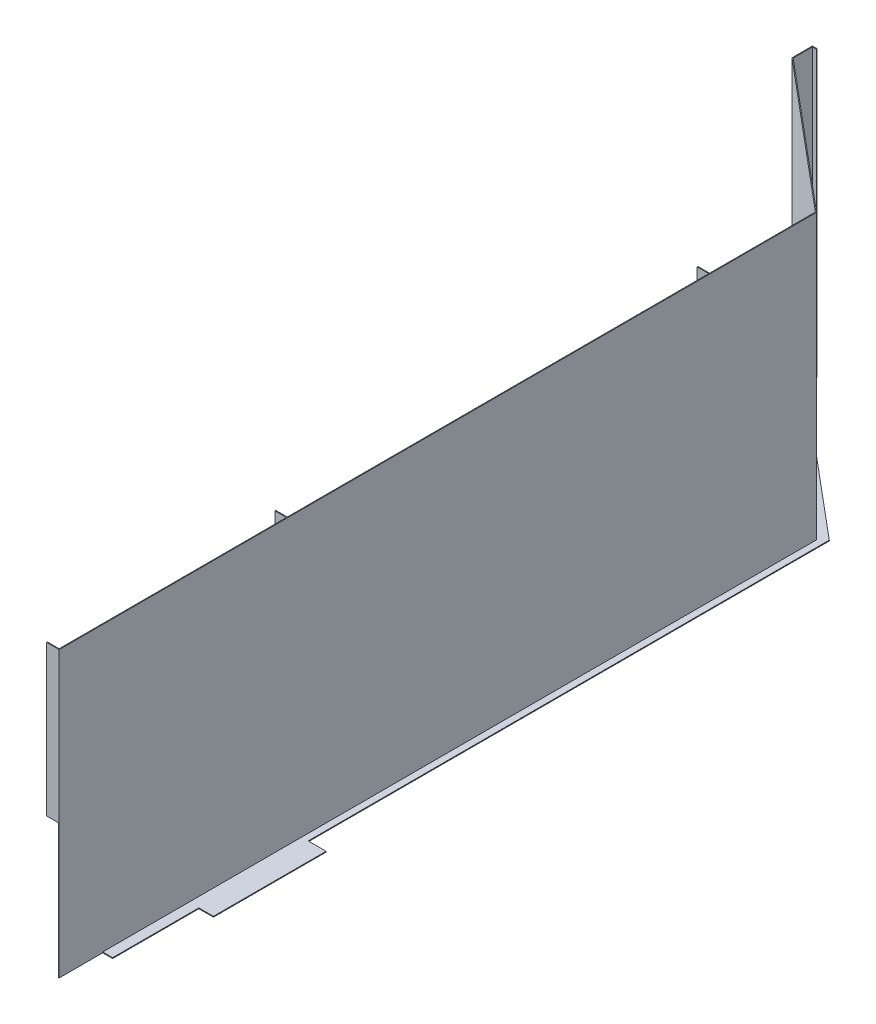
ISO-10303-21;
HEADER;
FILE_DESCRIPTION(('STEP AP214'),'2;1');
FILE_NAME('part.step','',(''),(''),'','','');
FILE_SCHEMA(('AUTOMOTIVE_DESIGN { 1 0 10303 214 1 1 1 1 }'));
ENDSEC;
DATA;
#1=APPLICATION_CONTEXT('core data for automotive mechanical design processes');
#2=APPLICATION_PROTOCOL_DEFINITION('international standard','automotive_design',2000,#1);
#3=PRODUCT_CONTEXT('',#1,'mechanical');
#4=PRODUCT('Part','Part','',(#3));
#5=PRODUCT_RELATED_PRODUCT_CATEGORY('part','',(#4));
#6=PRODUCT_DEFINITION_FORMATION('','',#4);
#7=PRODUCT_DEFINITION_CONTEXT('part definition',#1,'design');
#8=PRODUCT_DEFINITION('design','',#6,#7);
#9=PRODUCT_DEFINITION_SHAPE('','',#8);
#10=(LENGTH_UNIT() NAMED_UNIT(*) SI_UNIT(.MILLI.,.METRE.));
#11=(NAMED_UNIT(*) PLANE_ANGLE_UNIT() SI_UNIT($,.RADIAN.));
#12=(NAMED_UNIT(*) SI_UNIT($,.STERADIAN.) SOLID_ANGLE_UNIT());
#13=UNCERTAINTY_MEASURE_WITH_UNIT(LENGTH_MEASURE(1.E-05),#10,'distance_accuracy_value','');
#14=(GEOMETRIC_REPRESENTATION_CONTEXT(3) GLOBAL_UNCERTAINTY_ASSIGNED_CONTEXT((#13)) GLOBAL_UNIT_ASSIGNED_CONTEXT((#10,
#11,#12)) REPRESENTATION_CONTEXT('',''));
#15=CARTESIAN_POINT('',(0.,0.,0.));
#16=DIRECTION('',(0.,0.,1.));
#17=DIRECTION('',(1.,0.,0.));
#18=AXIS2_PLACEMENT_3D('',#15,#16,#17);
#19=CARTESIAN_POINT('',(1030.,1386.,1771.15));
#20=DIRECTION('',(0.,1.,0.));
#21=DIRECTION('',(0.,0.,-1.));
#22=AXIS2_PLACEMENT_3D('',#19,#20,#21);
#23=PLANE('',#22);
#24=DIRECTION('',(0.,0.,1.));
#25=VECTOR('',#24,1.);
#26=CARTESIAN_POINT('',(1000.,1386.,1769.15));
#27=LINE('',#26,#25);
#28=CARTESIAN_POINT('',(1000.,1386.,1769.15));
#29=VERTEX_POINT('',#28);
#30=CARTESIAN_POINT('',(1000.,1386.,1771.15));
#31=VERTEX_POINT('',#30);
#32=EDGE_CURVE('E42',#29,#31,#27,.T.);
#33=ORIENTED_EDGE('',*,*,#32,.F.);
#34=DIRECTION('',(-1.,0.,0.));
#35=VECTOR('',#34,1.);
#36=CARTESIAN_POINT('',(1030.,1386.,1769.15));
#37=LINE('',#36,#35);
#38=CARTESIAN_POINT('',(1030.,1386.,1769.15));
#39=VERTEX_POINT('',#38);
#40=EDGE_CURVE('E453',#39,#29,#37,.T.);
#41=ORIENTED_EDGE('',*,*,#40,.F.);
#42=DIRECTION('',(0.,0.,-1.));
#43=VECTOR('',#42,1.);
#44=CARTESIAN_POINT('',(1030.,1386.,1771.15));
#45=LINE('',#44,#43);
#46=CARTESIAN_POINT('',(1030.,1386.,1771.15));
#47=VERTEX_POINT('',#46);
#48=EDGE_CURVE('E487',#47,#39,#45,.T.);
#49=ORIENTED_EDGE('',*,*,#48,.F.);
#50=DIRECTION('',(1.,0.,0.));
#51=VECTOR('',#50,1.);
#52=CARTESIAN_POINT('',(1000.,1386.,1771.15));
#53=LINE('',#52,#51);
#54=EDGE_CURVE('E11',#31,#47,#53,.T.);
#55=ORIENTED_EDGE('',*,*,#54,.F.);
#56=EDGE_LOOP('',(#33,#41,#49,#55));
#57=FACE_BOUND('',#56,.T.);
#58=ADVANCED_FACE('F17',(#57),#23,.F.);
#59=CARTESIAN_POINT('',(1000.,1041.,1771.15));
#60=DIRECTION('',(0.,0.,1.));
#61=DIRECTION('',(1.,0.,0.));
#62=AXIS2_PLACEMENT_3D('',#59,#60,#61);
#63=PLANE('',#62);
#64=DIRECTION('',(0.,1.,0.));
#65=VECTOR('',#64,1.);
#66=CARTESIAN_POINT('',(1000.,1386.,1771.15));
#67=LINE('',#66,#65);
#68=CARTESIAN_POINT('',(1000.,1773.,1771.15));
#69=VERTEX_POINT('',#68);
#70=EDGE_CURVE('E558',#31,#69,#67,.T.);
#71=ORIENTED_EDGE('',*,*,#70,.F.);
#72=ORIENTED_EDGE('',*,*,#54,.T.);
#73=DIRECTION('',(0.,1.,0.));
#74=VECTOR('',#73,1.);
#75=CARTESIAN_POINT('',(1030.,1041.,1771.15));
#76=LINE('',#75,#74);
#77=CARTESIAN_POINT('',(1030.,1041.,1771.15));
#78=VERTEX_POINT('',#77);
#79=EDGE_CURVE('E350',#78,#47,#76,.T.);
#80=ORIENTED_EDGE('',*,*,#79,.F.);
#81=DIRECTION('',(1.,0.,0.));
#82=VECTOR('',#81,1.);
#83=CARTESIAN_POINT('',(1030.,1041.,1771.15));
#84=LINE('',#83,#82);
#85=CARTESIAN_POINT('',(1032.,1041.,1771.15));
#86=VERTEX_POINT('',#85);
#87=EDGE_CURVE('E28',#78,#86,#84,.T.);
#88=ORIENTED_EDGE('',*,*,#87,.T.);
#89=DIRECTION('',(0.,1.,0.));
#90=VECTOR('',#89,1.);
#91=CARTESIAN_POINT('',(1032.,1041.,1771.15));
#92=LINE('',#91,#90);
#93=CARTESIAN_POINT('',(1032.,1773.,1771.15));
#94=VERTEX_POINT('',#93);
#95=EDGE_CURVE('E332',#86,#94,#92,.T.);
#96=ORIENTED_EDGE('',*,*,#95,.T.);
#97=DIRECTION('',(1.,0.,0.));
#98=VECTOR('',#97,1.);
#99=CARTESIAN_POINT('',(1000.,1773.,1771.15));
#100=LINE('',#99,#98);
#101=EDGE_CURVE('E366',#69,#94,#100,.T.);
#102=ORIENTED_EDGE('',*,*,#101,.F.);
#103=EDGE_LOOP('',(#71,#72,#80,#88,#96,#102));
#104=FACE_BOUND('',#103,.T.);
#105=ADVANCED_FACE('F348',(#104),#63,.T.);
#106=CARTESIAN_POINT('',(1095.,1773.,1821.15));
#107=DIRECTION('',(0.,-1.,0.));
#108=DIRECTION('',(1.,0.,0.));
#109=AXIS2_PLACEMENT_3D('',#106,#107,#108);
#110=PLANE('',#109);
#111=DIRECTION('',(-0.766044443119007,0.,-0.642787609686505));
#112=VECTOR('',#111,1.);
#113=CARTESIAN_POINT('',(1032.,1773.,-178.026737939697));
#114=LINE('',#113,#112);
#115=CARTESIAN_POINT('',(1032.,1773.,-178.026737939697));
#116=VERTEX_POINT('',#115);
#117=CARTESIAN_POINT('',(658.,1773.,-491.85));
#118=VERTEX_POINT('',#117);
#119=EDGE_CURVE('E344',#116,#118,#114,.T.);
#120=ORIENTED_EDGE('',*,*,#119,.T.);
#121=DIRECTION('',(0.,0.,-1.));
#122=VECTOR('',#121,1.);
#123=CARTESIAN_POINT('',(658.,1773.,-491.85));
#124=LINE('',#123,#122);
#125=CARTESIAN_POINT('',(658.,1773.,-541.35));
#126=VERTEX_POINT('',#125);
#127=EDGE_CURVE('E395',#118,#126,#124,.T.);
#128=ORIENTED_EDGE('',*,*,#127,.T.);
#129=DIRECTION('',(1.,0.,0.));
#130=VECTOR('',#129,1.);
#131=CARTESIAN_POINT('',(658.,1773.,-541.35));
#132=LINE('',#131,#130);
#133=CARTESIAN_POINT('',(668.,1773.,-541.35));
#134=VERTEX_POINT('',#133);
#135=EDGE_CURVE('E590',#126,#134,#132,.T.);
#136=ORIENTED_EDGE('',*,*,#135,.T.);
#137=DIRECTION('',(0.,0.,-1.));
#138=VECTOR('',#137,1.);
#139=CARTESIAN_POINT('',(668.,1773.,-541.35));
#140=LINE('',#139,#138);
#141=CARTESIAN_POINT('',(668.,1773.,-543.35));
#142=VERTEX_POINT('',#141);
#143=EDGE_CURVE('E553',#134,#142,#140,.T.);
#144=ORIENTED_EDGE('',*,*,#143,.T.);
#145=DIRECTION('',(-1.,0.,0.));
#146=VECTOR('',#145,1.);
#147=CARTESIAN_POINT('',(668.,1773.,-543.35));
#148=LINE('',#147,#146);
#149=CARTESIAN_POINT('',(656.,1773.,-543.35));
#150=VERTEX_POINT('',#149);
#151=EDGE_CURVE('E549',#142,#150,#148,.T.);
#152=ORIENTED_EDGE('',*,*,#151,.T.);
#153=DIRECTION('',(0.,0.,1.));
#154=VECTOR('',#153,1.);
#155=CARTESIAN_POINT('',(656.,1773.,-543.35));
#156=LINE('',#155,#154);
#157=CARTESIAN_POINT('',(656.,1773.,-490.917384683687));
#158=VERTEX_POINT('',#157);
#159=EDGE_CURVE('E554',#150,#158,#156,.T.);
#160=ORIENTED_EDGE('',*,*,#159,.T.);
#161=DIRECTION('',(0.766044443119007,0.,0.642787609686505));
#162=VECTOR('',#161,1.);
#163=CARTESIAN_POINT('',(656.,1773.,-490.917384683687));
#164=LINE('',#163,#162);
#165=CARTESIAN_POINT('',(1030.,1773.,-177.094122623397));
#166=VERTEX_POINT('',#165);
#167=EDGE_CURVE('E691',#158,#166,#164,.T.);
#168=ORIENTED_EDGE('',*,*,#167,.T.);
#169=DIRECTION('',(0.,0.,1.));
#170=VECTOR('',#169,1.);
#171=CARTESIAN_POINT('',(1030.,1773.,-177.094122623397));
#172=LINE('',#171,#170);
#173=CARTESIAN_POINT('',(1030.,1773.,95.150000000003));
#174=VERTEX_POINT('',#173);
#175=EDGE_CURVE('E257',#166,#174,#172,.T.);
#176=ORIENTED_EDGE('',*,*,#175,.T.);
#177=DIRECTION('',(-1.,0.,0.));
#178=VECTOR('',#177,1.);
#179=CARTESIAN_POINT('',(1030.,1773.,95.150000000003));
#180=LINE('',#179,#178);
#181=CARTESIAN_POINT('',(1000.,1773.,95.150000000003));
#182=VERTEX_POINT('',#181);
#183=EDGE_CURVE('E264',#174,#182,#180,.T.);
#184=ORIENTED_EDGE('',*,*,#183,.T.);
#185=DIRECTION('',(0.,0.,1.));
#186=VECTOR('',#185,1.);
#187=CARTESIAN_POINT('',(1000.,1773.,95.150000000003));
#188=LINE('',#187,#186);
#189=CARTESIAN_POINT('',(1000.,1773.,97.150000000003));
#190=VERTEX_POINT('',#189);
#191=EDGE_CURVE('E372',#182,#190,#188,.T.);
#192=ORIENTED_EDGE('',*,*,#191,.T.);
#193=DIRECTION('',(-1.,0.,0.));
#194=VECTOR('',#193,1.);
#195=CARTESIAN_POINT('',(1030.,1773.,97.150000000003));
#196=LINE('',#195,#194);
#197=CARTESIAN_POINT('',(1030.,1773.,97.150000000003));
#198=VERTEX_POINT('',#197);
#199=EDGE_CURVE('E467',#198,#190,#196,.T.);
#200=ORIENTED_EDGE('',*,*,#199,.F.);
#201=DIRECTION('',(0.,0.,1.));
#202=VECTOR('',#201,1.);
#203=CARTESIAN_POINT('',(1030.,1773.,97.150000000003));
#204=LINE('',#203,#202);
#205=CARTESIAN_POINT('',(1030.,1773.,1182.15));
#206=VERTEX_POINT('',#205);
#207=EDGE_CURVE('E376',#198,#206,#204,.T.);
#208=ORIENTED_EDGE('',*,*,#207,.T.);
#209=DIRECTION('',(-1.,0.,0.));
#210=VECTOR('',#209,1.);
#211=CARTESIAN_POINT('',(1030.,1773.,1182.15));
#212=LINE('',#211,#210);
#213=CARTESIAN_POINT('',(1000.,1773.,1182.15));
#214=VERTEX_POINT('',#213);
#215=EDGE_CURVE('E429',#206,#214,#212,.T.);
#216=ORIENTED_EDGE('',*,*,#215,.T.);
#217=DIRECTION('',(0.,0.,1.));
#218=VECTOR('',#217,1.);
#219=CARTESIAN_POINT('',(1000.,1773.,1182.15));
#220=LINE('',#219,#218);
#221=CARTESIAN_POINT('',(1000.,1773.,1184.15));
#222=VERTEX_POINT('',#221);
#223=EDGE_CURVE('E433',#214,#222,#220,.T.);
#224=ORIENTED_EDGE('',*,*,#223,.T.);
#225=DIRECTION('',(-1.,0.,0.));
#226=VECTOR('',#225,1.);
#227=CARTESIAN_POINT('',(1030.,1773.,1184.15));
#228=LINE('',#227,#226);
#229=CARTESIAN_POINT('',(1030.,1773.,1184.15));
#230=VERTEX_POINT('',#229);
#231=EDGE_CURVE('E294',#230,#222,#228,.T.);
#232=ORIENTED_EDGE('',*,*,#231,.F.);
#233=DIRECTION('',(0.,0.,1.));
#234=VECTOR('',#233,1.);
#235=CARTESIAN_POINT('',(1030.,1773.,1184.15));
#236=LINE('',#235,#234);
#237=CARTESIAN_POINT('',(1030.,1773.,1769.15));
#238=VERTEX_POINT('',#237);
#239=EDGE_CURVE('E492',#230,#238,#236,.T.);
#240=ORIENTED_EDGE('',*,*,#239,.T.);
#241=DIRECTION('',(-1.,0.,0.));
#242=VECTOR('',#241,1.);
#243=CARTESIAN_POINT('',(1030.,1773.,1769.15));
#244=LINE('',#243,#242);
#245=CARTESIAN_POINT('',(1000.,1773.,1769.15));
#246=VERTEX_POINT('',#245);
#247=EDGE_CURVE('E303',#238,#246,#244,.T.);
#248=ORIENTED_EDGE('',*,*,#247,.T.);
#249=DIRECTION('',(0.,0.,1.));
#250=VECTOR('',#249,1.);
#251=CARTESIAN_POINT('',(1000.,1773.,1769.15));
#252=LINE('',#251,#250);
#253=EDGE_CURVE('E493',#246,#69,#252,.T.);
#254=ORIENTED_EDGE('',*,*,#253,.T.);
#255=ORIENTED_EDGE('',*,*,#101,.T.);
#256=DIRECTION('',(0.,0.,-1.));
#257=VECTOR('',#256,1.);
#258=CARTESIAN_POINT('',(1032.,1773.,1771.15));
#259=LINE('',#258,#257);
#260=EDGE_CURVE('E340',#94,#116,#259,.T.);
#261=ORIENTED_EDGE('',*,*,#260,.T.);
#262=EDGE_LOOP('',(#120,#128,#136,#144,#152,#160,#168,#176,#184,#192,#200,#208,#216,#224,#232,
#240,#248,#254,#255,#261));
#263=FACE_BOUND('',#262,.T.);
#264=ADVANCED_FACE('F720',(#263),#110,.F.);
#265=CARTESIAN_POINT('',(1032.,1041.,1771.15));
#266=DIRECTION('',(1.,0.,0.));
#267=DIRECTION('',(0.,0.,1.));
#268=AXIS2_PLACEMENT_3D('',#265,#266,#267);
#269=PLANE('',#268);
#270=ORIENTED_EDGE('',*,*,#95,.F.);
#271=DIRECTION('',(0.,0.,-1.));
#272=VECTOR('',#271,1.);
#273=CARTESIAN_POINT('',(1032.,1041.,1771.15));
#274=LINE('',#273,#272);
#275=CARTESIAN_POINT('',(1032.,1041.,1659.15));
#276=VERTEX_POINT('',#275);
#277=EDGE_CURVE('E337',#86,#276,#274,.T.);
#278=ORIENTED_EDGE('',*,*,#277,.T.);
#279=DIRECTION('',(0.,1.,0.));
#280=VECTOR('',#279,1.);
#281=CARTESIAN_POINT('',(1032.,1041.,1659.15));
#282=LINE('',#281,#280);
#283=CARTESIAN_POINT('',(1032.,1043.,1659.15));
#284=VERTEX_POINT('',#283);
#285=EDGE_CURVE('E361',#276,#284,#282,.T.);
#286=ORIENTED_EDGE('',*,*,#285,.T.);
#287=DIRECTION('',(0.,0.,1.));
#288=VECTOR('',#287,1.);
#289=CARTESIAN_POINT('',(1032.,1043.,-178.026737939697));
#290=LINE('',#289,#288);
#291=CARTESIAN_POINT('',(1032.,1043.,-178.026737939697));
#292=VERTEX_POINT('',#291);
#293=EDGE_CURVE('E399',#292,#284,#290,.T.);
#294=ORIENTED_EDGE('',*,*,#293,.F.);
#295=DIRECTION('',(0.,1.,0.));
#296=VECTOR('',#295,1.);
#297=CARTESIAN_POINT('',(1032.,1043.,-178.026737939697));
#298=LINE('',#297,#296);
#299=EDGE_CURVE('E368',#292,#116,#298,.T.);
#300=ORIENTED_EDGE('',*,*,#299,.T.);
#301=ORIENTED_EDGE('',*,*,#260,.F.);
#302=EDGE_LOOP('',(#270,#278,#286,#294,#300,#301));
#303=FACE_BOUND('',#302,.T.);
#304=ADVANCED_FACE('F334',(#303),#269,.T.);
#305=CARTESIAN_POINT('',(1032.,1041.,-178.026737939697));
#306=DIRECTION('',(0.642787609686505,0.,-0.766044443119007));
#307=DIRECTION('',(0.,1.,0.));
#308=AXIS2_PLACEMENT_3D('',#305,#306,#307);
#309=PLANE('',#308);
#310=ORIENTED_EDGE('',*,*,#299,.F.);
#311=DIRECTION('',(-0.766044443119007,0.,-0.642787609686505));
#312=VECTOR('',#311,1.);
#313=CARTESIAN_POINT('',(1032.,1043.,-178.026737939697));
#314=LINE('',#313,#312);
#315=CARTESIAN_POINT('',(668.,1043.,-483.459003688227));
#316=VERTEX_POINT('',#315);
#317=EDGE_CURVE('E377',#292,#316,#314,.T.);
#318=ORIENTED_EDGE('',*,*,#317,.T.);
#319=DIRECTION('',(0.,1.,0.));
#320=VECTOR('',#319,1.);
#321=CARTESIAN_POINT('',(668.,1043.,-483.459003688227));
#322=LINE('',#321,#320);
#323=CARTESIAN_POINT('',(668.,1320.,-483.459003688227));
#324=VERTEX_POINT('',#323);
#325=EDGE_CURVE('E381',#316,#324,#322,.T.);
#326=ORIENTED_EDGE('',*,*,#325,.T.);
#327=DIRECTION('',(-0.766044443119007,0.,-0.642787609686505));
#328=VECTOR('',#327,1.);
#329=CARTESIAN_POINT('',(668.,1320.,-483.459003688227));
#330=LINE('',#329,#328);
#331=CARTESIAN_POINT('',(658.,1320.,-491.85));
#332=VERTEX_POINT('',#331);
#333=EDGE_CURVE('E417',#324,#332,#330,.T.);
#334=ORIENTED_EDGE('',*,*,#333,.T.);
#335=DIRECTION('',(0.,1.,0.));
#336=VECTOR('',#335,1.);
#337=CARTESIAN_POINT('',(658.,1320.,-491.85));
#338=LINE('',#337,#336);
#339=EDGE_CURVE('E437',#332,#118,#338,.T.);
#340=ORIENTED_EDGE('',*,*,#339,.T.);
#341=ORIENTED_EDGE('',*,*,#119,.F.);
#342=EDGE_LOOP('',(#310,#318,#326,#334,#340,#341));
#343=FACE_BOUND('',#342,.T.);
#344=ADVANCED_FACE('F819',(#343),#309,.T.);
#345=CARTESIAN_POINT('',(658.,1041.,-491.85));
#346=DIRECTION('',(1.,0.,0.));
#347=DIRECTION('',(0.,0.,1.));
#348=AXIS2_PLACEMENT_3D('',#345,#346,#347);
#349=PLANE('',#348);
#350=ORIENTED_EDGE('',*,*,#339,.F.);
#351=DIRECTION('',(0.,0.,-1.));
#352=VECTOR('',#351,1.);
#353=CARTESIAN_POINT('',(658.,1320.,-491.85));
#354=LINE('',#353,#352);
#355=CARTESIAN_POINT('',(658.,1320.,-541.35));
#356=VERTEX_POINT('',#355);
#357=EDGE_CURVE('E440',#332,#356,#354,.T.);
#358=ORIENTED_EDGE('',*,*,#357,.T.);
#359=DIRECTION('',(0.,1.,0.));
#360=VECTOR('',#359,1.);
#361=CARTESIAN_POINT('',(658.,1320.,-541.35));
#362=LINE('',#361,#360);
#363=EDGE_CURVE('E529',#356,#126,#362,.T.);
#364=ORIENTED_EDGE('',*,*,#363,.T.);
#365=ORIENTED_EDGE('',*,*,#127,.F.);
#366=EDGE_LOOP('',(#350,#358,#364,#365));
#367=FACE_BOUND('',#366,.T.);
#368=ADVANCED_FACE('F724',(#367),#349,.T.);
#369=CARTESIAN_POINT('',(658.,1041.,-541.35));
#370=DIRECTION('',(0.,0.,1.));
#371=DIRECTION('',(1.,0.,0.));
#372=AXIS2_PLACEMENT_3D('',#369,#370,#371);
#373=PLANE('',#372);
#374=ORIENTED_EDGE('',*,*,#363,.F.);
#375=DIRECTION('',(1.,0.,0.));
#376=VECTOR('',#375,1.);
#377=CARTESIAN_POINT('',(658.,1320.,-541.35));
#378=LINE('',#377,#376);
#379=CARTESIAN_POINT('',(668.,1320.,-541.35));
#380=VERTEX_POINT('',#379);
#381=EDGE_CURVE('E503',#356,#380,#378,.T.);
#382=ORIENTED_EDGE('',*,*,#381,.T.);
#383=DIRECTION('',(0.,1.,0.));
#384=VECTOR('',#383,1.);
#385=CARTESIAN_POINT('',(668.,1320.,-541.35));
#386=LINE('',#385,#384);
#387=EDGE_CURVE('E499',#380,#134,#386,.T.);
#388=ORIENTED_EDGE('',*,*,#387,.T.);
#389=ORIENTED_EDGE('',*,*,#135,.F.);
#390=EDGE_LOOP('',(#374,#382,#388,#389));
#391=FACE_BOUND('',#390,.T.);
#392=ADVANCED_FACE('F728',(#391),#373,.T.);
#393=CARTESIAN_POINT('',(668.,1041.,-541.35));
#394=DIRECTION('',(1.,0.,0.));
#395=DIRECTION('',(0.,0.,1.));
#396=AXIS2_PLACEMENT_3D('',#393,#394,#395);
#397=PLANE('',#396);
#398=ORIENTED_EDGE('',*,*,#387,.F.);
#399=DIRECTION('',(0.,0.,1.));
#400=VECTOR('',#399,1.);
#401=CARTESIAN_POINT('',(668.,1320.,-541.35));
#402=LINE('',#401,#400);
#403=EDGE_CURVE('E504',#380,#324,#402,.T.);
#404=ORIENTED_EDGE('',*,*,#403,.T.);
#405=ORIENTED_EDGE('',*,*,#325,.F.);
#406=DIRECTION('',(0.,0.,-1.));
#407=VECTOR('',#406,1.);
#408=CARTESIAN_POINT('',(668.,1043.,-483.459003688227));
#409=LINE('',#408,#407);
#410=CARTESIAN_POINT('',(668.,1043.,-513.483371342867));
#411=VERTEX_POINT('',#410);
#412=EDGE_CURVE('E533',#316,#411,#409,.T.);
#413=ORIENTED_EDGE('',*,*,#412,.T.);
#414=DIRECTION('',(0.,1.,0.));
#415=VECTOR('',#414,1.);
#416=CARTESIAN_POINT('',(668.,1041.,-513.483371342867));
#417=LINE('',#416,#415);
#418=CARTESIAN_POINT('',(668.,1041.,-513.483371342867));
#419=VERTEX_POINT('',#418);
#420=EDGE_CURVE('E396',#419,#411,#417,.T.);
#421=ORIENTED_EDGE('',*,*,#420,.F.);
#422=DIRECTION('',(0.,0.,1.));
#423=VECTOR('',#422,1.);
#424=CARTESIAN_POINT('',(668.,1041.,-543.35));
#425=LINE('',#424,#423);
#426=CARTESIAN_POINT('',(668.,1041.,-543.35));
#427=VERTEX_POINT('',#426);
#428=EDGE_CURVE('E92',#427,#419,#425,.T.);
#429=ORIENTED_EDGE('',*,*,#428,.F.);
#430=DIRECTION('',(0.,1.,0.));
#431=VECTOR('',#430,1.);
#432=CARTESIAN_POINT('',(668.,1041.,-543.35));
#433=LINE('',#432,#431);
#434=EDGE_CURVE('E575',#427,#142,#433,.T.);
#435=ORIENTED_EDGE('',*,*,#434,.T.);
#436=ORIENTED_EDGE('',*,*,#143,.F.);
#437=EDGE_LOOP('',(#398,#404,#405,#413,#421,#429,#435,#436));
#438=FACE_BOUND('',#437,.T.);
#439=ADVANCED_FACE('F730',(#438),#397,.T.);
#440=CARTESIAN_POINT('',(668.,1041.,-543.35));
#441=DIRECTION('',(0.,0.,-1.));
#442=DIRECTION('',(0.,1.,0.));
#443=AXIS2_PLACEMENT_3D('',#440,#441,#442);
#444=PLANE('',#443);
#445=ORIENTED_EDGE('',*,*,#434,.F.);
#446=DIRECTION('',(1.,0.,0.));
#447=VECTOR('',#446,1.);
#448=CARTESIAN_POINT('',(666.,1041.,-543.35));
#449=LINE('',#448,#447);
#450=CARTESIAN_POINT('',(666.,1041.,-543.35));
#451=VERTEX_POINT('',#450);
#452=EDGE_CURVE('E454',#451,#427,#449,.T.);
#453=ORIENTED_EDGE('',*,*,#452,.F.);
#454=DIRECTION('',(0.,-1.,0.));
#455=VECTOR('',#454,1.);
#456=CARTESIAN_POINT('',(666.,1318.,-543.35));
#457=LINE('',#456,#455);
#458=CARTESIAN_POINT('',(666.,1318.,-543.35));
#459=VERTEX_POINT('',#458);
#460=EDGE_CURVE('E105',#459,#451,#457,.T.);
#461=ORIENTED_EDGE('',*,*,#460,.F.);
#462=DIRECTION('',(1.,0.,0.));
#463=VECTOR('',#462,1.);
#464=CARTESIAN_POINT('',(656.,1318.,-543.35));
#465=LINE('',#464,#463);
#466=CARTESIAN_POINT('',(656.,1318.,-543.35));
#467=VERTEX_POINT('',#466);
#468=EDGE_CURVE('E568',#467,#459,#465,.T.);
#469=ORIENTED_EDGE('',*,*,#468,.F.);
#470=DIRECTION('',(0.,-1.,0.));
#471=VECTOR('',#470,1.);
#472=CARTESIAN_POINT('',(656.,1773.,-543.35));
#473=LINE('',#472,#471);
#474=EDGE_CURVE('E694',#150,#467,#473,.T.);
#475=ORIENTED_EDGE('',*,*,#474,.F.);
#476=ORIENTED_EDGE('',*,*,#151,.F.);
#477=EDGE_LOOP('',(#445,#453,#461,#469,#475,#476));
#478=FACE_BOUND('',#477,.T.);
#479=ADVANCED_FACE('F734',(#478),#444,.T.);
#480=CARTESIAN_POINT('',(656.,1041.,-543.35));
#481=DIRECTION('',(-1.,0.,0.));
#482=DIRECTION('',(0.,-1.,0.));
#483=AXIS2_PLACEMENT_3D('',#480,#481,#482);
#484=PLANE('',#483);
#485=ORIENTED_EDGE('',*,*,#474,.T.);
#486=DIRECTION('',(0.,0.,-1.));
#487=VECTOR('',#486,1.);
#488=CARTESIAN_POINT('',(656.,1318.,-490.917384683687));
#489=LINE('',#488,#487);
#490=CARTESIAN_POINT('',(656.,1318.,-490.917384683687));
#491=VERTEX_POINT('',#490);
#492=EDGE_CURVE('E428',#491,#467,#489,.T.);
#493=ORIENTED_EDGE('',*,*,#492,.F.);
#494=DIRECTION('',(0.,1.,0.));
#495=VECTOR('',#494,1.);
#496=CARTESIAN_POINT('',(656.,1318.,-490.917384683687));
#497=LINE('',#496,#495);
#498=EDGE_CURVE('E519',#491,#158,#497,.T.);
#499=ORIENTED_EDGE('',*,*,#498,.T.);
#500=ORIENTED_EDGE('',*,*,#159,.F.);
#501=EDGE_LOOP('',(#485,#493,#499,#500));
#502=FACE_BOUND('',#501,.T.);
#503=ADVANCED_FACE('F842',(#502),#484,.T.);
#504=CARTESIAN_POINT('',(656.,1041.,-490.917384683687));
#505=DIRECTION('',(-0.642787609686505,0.,0.766044443119007));
#506=DIRECTION('',(0.,-1.,0.));
#507=AXIS2_PLACEMENT_3D('',#504,#505,#506);
#508=PLANE('',#507);
#509=ORIENTED_EDGE('',*,*,#498,.F.);
#510=DIRECTION('',(-0.766044443119007,0.,-0.642787609686505));
#511=VECTOR('',#510,1.);
#512=CARTESIAN_POINT('',(666.,1318.,-482.526388371917));
#513=LINE('',#512,#511);
#514=CARTESIAN_POINT('',(666.,1318.,-482.526388371917));
#515=VERTEX_POINT('',#514);
#516=EDGE_CURVE('E424',#515,#491,#513,.T.);
#517=ORIENTED_EDGE('',*,*,#516,.F.);
#518=DIRECTION('',(0.,-1.,0.));
#519=VECTOR('',#518,1.);
#520=CARTESIAN_POINT('',(666.,1318.,-482.526388371917));
#521=LINE('',#520,#519);
#522=CARTESIAN_POINT('',(666.,1041.,-482.526388371917));
#523=VERTEX_POINT('',#522);
#524=EDGE_CURVE('E515',#515,#523,#521,.T.);
#525=ORIENTED_EDGE('',*,*,#524,.T.);
#526=DIRECTION('',(-0.766044443119007,0.,-0.642787609686505));
#527=VECTOR('',#526,1.);
#528=CARTESIAN_POINT('',(1030.,1041.,-177.094122623397));
#529=LINE('',#528,#527);
#530=CARTESIAN_POINT('',(1030.,1041.,-177.094122623397));
#531=VERTEX_POINT('',#530);
#532=EDGE_CURVE('E555',#531,#523,#529,.T.);
#533=ORIENTED_EDGE('',*,*,#532,.F.);
#534=DIRECTION('',(0.,1.,0.));
#535=VECTOR('',#534,1.);
#536=CARTESIAN_POINT('',(1030.,1041.,-177.094122623397));
#537=LINE('',#536,#535);
#538=EDGE_CURVE('E486',#531,#166,#537,.T.);
#539=ORIENTED_EDGE('',*,*,#538,.T.);
#540=ORIENTED_EDGE('',*,*,#167,.F.);
#541=EDGE_LOOP('',(#509,#517,#525,#533,#539,#540));
#542=FACE_BOUND('',#541,.T.);
#543=ADVANCED_FACE('F845',(#542),#508,.T.);
#544=CARTESIAN_POINT('',(1030.,1041.,-177.094122623397));
#545=DIRECTION('',(-1.,0.,0.));
#546=DIRECTION('',(0.,-1.,0.));
#547=AXIS2_PLACEMENT_3D('',#544,#545,#546);
#548=PLANE('',#547);
#549=ORIENTED_EDGE('',*,*,#538,.F.);
#550=DIRECTION('',(0.,0.,-1.));
#551=VECTOR('',#550,1.);
#552=CARTESIAN_POINT('',(1030.,1041.,1771.15));
#553=LINE('',#552,#551);
#554=EDGE_CURVE('E403',#78,#531,#553,.T.);
#555=ORIENTED_EDGE('',*,*,#554,.F.);
#556=ORIENTED_EDGE('',*,*,#79,.T.);
#557=ORIENTED_EDGE('',*,*,#48,.T.);
#558=DIRECTION('',(0.,1.,0.));
#559=VECTOR('',#558,1.);
#560=CARTESIAN_POINT('',(1030.,1386.,1769.15));
#561=LINE('',#560,#559);
#562=EDGE_CURVE('E537',#39,#238,#561,.T.);
#563=ORIENTED_EDGE('',*,*,#562,.T.);
#564=ORIENTED_EDGE('',*,*,#239,.F.);
#565=DIRECTION('',(0.,1.,0.));
#566=VECTOR('',#565,1.);
#567=CARTESIAN_POINT('',(1030.,1507.,1184.15));
#568=LINE('',#567,#566);
#569=CARTESIAN_POINT('',(1030.,1507.,1184.15));
#570=VERTEX_POINT('',#569);
#571=EDGE_CURVE('E462',#570,#230,#568,.T.);
#572=ORIENTED_EDGE('',*,*,#571,.F.);
#573=DIRECTION('',(0.,0.,1.));
#574=VECTOR('',#573,1.);
#575=CARTESIAN_POINT('',(1030.,1507.,95.150000000003));
#576=LINE('',#575,#574);
#577=CARTESIAN_POINT('',(1030.,1507.,95.150000000003));
#578=VERTEX_POINT('',#577);
#579=EDGE_CURVE('E209',#578,#570,#576,.T.);
#580=ORIENTED_EDGE('',*,*,#579,.F.);
#581=DIRECTION('',(0.,-1.,0.));
#582=VECTOR('',#581,1.);
#583=CARTESIAN_POINT('',(1030.,1773.,95.150000000003));
#584=LINE('',#583,#582);
#585=EDGE_CURVE('E534',#174,#578,#584,.T.);
#586=ORIENTED_EDGE('',*,*,#585,.F.);
#587=ORIENTED_EDGE('',*,*,#175,.F.);
#588=EDGE_LOOP('',(#549,#555,#556,#557,#563,#564,#572,#580,#586,#587));
#589=FACE_BOUND('',#588,.T.);
#590=ADVANCED_FACE('F19',(#589),#548,.T.);
#591=CARTESIAN_POINT('',(1030.,2211.,95.1500000000029));
#592=DIRECTION('',(0.,0.,-1.));
#593=DIRECTION('',(0.,1.,0.));
#594=AXIS2_PLACEMENT_3D('',#591,#592,#593);
#595=PLANE('',#594);
#596=ORIENTED_EDGE('',*,*,#585,.T.);
#597=DIRECTION('',(-1.,0.,0.));
#598=VECTOR('',#597,1.);
#599=CARTESIAN_POINT('',(1030.,1507.,95.150000000003));
#600=LINE('',#599,#598);
#601=CARTESIAN_POINT('',(1000.,1507.,95.150000000003));
#602=VERTEX_POINT('',#601);
#603=EDGE_CURVE('E538',#578,#602,#600,.T.);
#604=ORIENTED_EDGE('',*,*,#603,.T.);
#605=DIRECTION('',(0.,-1.,0.));
#606=VECTOR('',#605,1.);
#607=CARTESIAN_POINT('',(1000.,1773.,95.150000000003));
#608=LINE('',#607,#606);
#609=EDGE_CURVE('E217',#182,#602,#608,.T.);
#610=ORIENTED_EDGE('',*,*,#609,.F.);
#611=ORIENTED_EDGE('',*,*,#183,.F.);
#612=EDGE_LOOP('',(#596,#604,#610,#611));
#613=FACE_BOUND('',#612,.T.);
#614=ADVANCED_FACE('F773',(#613),#595,.T.);
#615=CARTESIAN_POINT('',(1000.,1041.,-541.35));
#616=DIRECTION('',(-1.,0.,0.));
#617=DIRECTION('',(0.,-1.,0.));
#618=AXIS2_PLACEMENT_3D('',#615,#616,#617);
#619=PLANE('',#618);
#620=ORIENTED_EDGE('',*,*,#609,.T.);
#621=DIRECTION('',(0.,0.,1.));
#622=VECTOR('',#621,1.);
#623=CARTESIAN_POINT('',(1000.,1507.,95.150000000003));
#624=LINE('',#623,#622);
#625=CARTESIAN_POINT('',(1000.,1507.,1184.15));
#626=VERTEX_POINT('',#625);
#627=EDGE_CURVE('E410',#602,#626,#624,.T.);
#628=ORIENTED_EDGE('',*,*,#627,.T.);
#629=DIRECTION('',(0.,1.,0.));
#630=VECTOR('',#629,1.);
#631=CARTESIAN_POINT('',(1000.,1507.,1184.15));
#632=LINE('',#631,#630);
#633=EDGE_CURVE('E413',#626,#222,#632,.T.);
#634=ORIENTED_EDGE('',*,*,#633,.T.);
#635=ORIENTED_EDGE('',*,*,#223,.F.);
#636=DIRECTION('',(0.,-1.,0.));
#637=VECTOR('',#636,1.);
#638=CARTESIAN_POINT('',(1000.,1773.,1182.15));
#639=LINE('',#638,#637);
#640=CARTESIAN_POINT('',(1000.,1509.,1182.15));
#641=VERTEX_POINT('',#640);
#642=EDGE_CURVE('E471',#214,#641,#639,.T.);
#643=ORIENTED_EDGE('',*,*,#642,.T.);
#644=DIRECTION('',(0.,0.,-1.));
#645=VECTOR('',#644,1.);
#646=CARTESIAN_POINT('',(1000.,1509.,1182.15));
#647=LINE('',#646,#645);
#648=CARTESIAN_POINT('',(1000.,1509.,97.150000000003));
#649=VERTEX_POINT('',#648);
#650=EDGE_CURVE('E475',#641,#649,#647,.T.);
#651=ORIENTED_EDGE('',*,*,#650,.T.);
#652=DIRECTION('',(0.,1.,0.));
#653=VECTOR('',#652,1.);
#654=CARTESIAN_POINT('',(1000.,1509.,97.150000000003));
#655=LINE('',#654,#653);
#656=EDGE_CURVE('E508',#649,#190,#655,.T.);
#657=ORIENTED_EDGE('',*,*,#656,.T.);
#658=ORIENTED_EDGE('',*,*,#191,.F.);
#659=EDGE_LOOP('',(#620,#628,#634,#635,#643,#651,#657,#658));
#660=FACE_BOUND('',#659,.T.);
#661=ADVANCED_FACE('F778',(#660),#619,.T.);
#662=CARTESIAN_POINT('',(1030.,1509.,97.150000000003));
#663=DIRECTION('',(0.,0.,1.));
#664=DIRECTION('',(1.,0.,0.));
#665=AXIS2_PLACEMENT_3D('',#662,#663,#664);
#666=PLANE('',#665);
#667=ORIENTED_EDGE('',*,*,#656,.F.);
#668=DIRECTION('',(-1.,0.,0.));
#669=VECTOR('',#668,1.);
#670=CARTESIAN_POINT('',(1030.,1509.,97.150000000003));
#671=LINE('',#670,#669);
#672=CARTESIAN_POINT('',(1030.,1509.,97.150000000003));
#673=VERTEX_POINT('',#672);
#674=EDGE_CURVE('E466',#673,#649,#671,.T.);
#675=ORIENTED_EDGE('',*,*,#674,.F.);
#676=DIRECTION('',(0.,1.,0.));
#677=VECTOR('',#676,1.);
#678=CARTESIAN_POINT('',(1030.,1509.,97.150000000003));
#679=LINE('',#678,#677);
#680=EDGE_CURVE('E470',#673,#198,#679,.T.);
#681=ORIENTED_EDGE('',*,*,#680,.T.);
#682=ORIENTED_EDGE('',*,*,#199,.T.);
#683=EDGE_LOOP('',(#667,#675,#681,#682));
#684=FACE_BOUND('',#683,.T.);
#685=ADVANCED_FACE('F794',(#684),#666,.T.);
#686=CARTESIAN_POINT('',(1030.,1041.,-177.094122623397));
#687=DIRECTION('',(-1.,0.,0.));
#688=DIRECTION('',(0.,-1.,0.));
#689=AXIS2_PLACEMENT_3D('',#686,#687,#688);
#690=PLANE('',#689);
#691=ORIENTED_EDGE('',*,*,#680,.F.);
#692=DIRECTION('',(0.,0.,-1.));
#693=VECTOR('',#692,1.);
#694=CARTESIAN_POINT('',(1030.,1509.,1182.15));
#695=LINE('',#694,#693);
#696=CARTESIAN_POINT('',(1030.,1509.,1182.15));
#697=VERTEX_POINT('',#696);
#698=EDGE_CURVE('E447',#697,#673,#695,.T.);
#699=ORIENTED_EDGE('',*,*,#698,.F.);
#700=DIRECTION('',(0.,-1.,0.));
#701=VECTOR('',#700,1.);
#702=CARTESIAN_POINT('',(1030.,1773.,1182.15));
#703=LINE('',#702,#701);
#704=EDGE_CURVE('E446',#206,#697,#703,.T.);
#705=ORIENTED_EDGE('',*,*,#704,.F.);
#706=ORIENTED_EDGE('',*,*,#207,.F.);
#707=EDGE_LOOP('',(#691,#699,#705,#706));
#708=FACE_BOUND('',#707,.T.);
#709=ADVANCED_FACE('F797',(#708),#690,.T.);
#710=CARTESIAN_POINT('',(1030.,2209.,1182.15));
#711=DIRECTION('',(0.,0.,-1.));
#712=DIRECTION('',(0.,1.,0.));
#713=AXIS2_PLACEMENT_3D('',#710,#711,#712);
#714=PLANE('',#713);
#715=ORIENTED_EDGE('',*,*,#704,.T.);
#716=DIRECTION('',(-1.,0.,0.));
#717=VECTOR('',#716,1.);
#718=CARTESIAN_POINT('',(1030.,1509.,1182.15));
#719=LINE('',#718,#717);
#720=EDGE_CURVE('E442',#697,#641,#719,.T.);
#721=ORIENTED_EDGE('',*,*,#720,.T.);
#722=ORIENTED_EDGE('',*,*,#642,.F.);
#723=ORIENTED_EDGE('',*,*,#215,.F.);
#724=EDGE_LOOP('',(#715,#721,#722,#723));
#725=FACE_BOUND('',#724,.T.);
#726=ADVANCED_FACE('F785',(#725),#714,.T.);
#727=CARTESIAN_POINT('',(1030.,1509.,1182.15));
#728=DIRECTION('',(0.,1.,0.));
#729=DIRECTION('',(0.,0.,-1.));
#730=AXIS2_PLACEMENT_3D('',#727,#728,#729);
#731=PLANE('',#730);
#732=ORIENTED_EDGE('',*,*,#698,.T.);
#733=ORIENTED_EDGE('',*,*,#674,.T.);
#734=ORIENTED_EDGE('',*,*,#650,.F.);
#735=ORIENTED_EDGE('',*,*,#720,.F.);
#736=EDGE_LOOP('',(#732,#733,#734,#735));
#737=FACE_BOUND('',#736,.T.);
#738=ADVANCED_FACE('F791',(#737),#731,.T.);
#739=CARTESIAN_POINT('',(1030.,1507.,1184.15));
#740=DIRECTION('',(0.,0.,1.));
#741=DIRECTION('',(1.,0.,0.));
#742=AXIS2_PLACEMENT_3D('',#739,#740,#741);
#743=PLANE('',#742);
#744=ORIENTED_EDGE('',*,*,#633,.F.);
#745=DIRECTION('',(-1.,0.,0.));
#746=VECTOR('',#745,1.);
#747=CARTESIAN_POINT('',(1030.,1507.,1184.15));
#748=LINE('',#747,#746);
#749=EDGE_CURVE('E452',#570,#626,#748,.T.);
#750=ORIENTED_EDGE('',*,*,#749,.F.);
#751=ORIENTED_EDGE('',*,*,#571,.T.);
#752=ORIENTED_EDGE('',*,*,#231,.T.);
#753=EDGE_LOOP('',(#744,#750,#751,#752));
#754=FACE_BOUND('',#753,.T.);
#755=ADVANCED_FACE('F780',(#754),#743,.T.);
#756=CARTESIAN_POINT('',(1030.,1507.,95.150000000003));
#757=DIRECTION('',(0.,-1.,0.));
#758=DIRECTION('',(1.,0.,0.));
#759=AXIS2_PLACEMENT_3D('',#756,#757,#758);
#760=PLANE('',#759);
#761=ORIENTED_EDGE('',*,*,#749,.T.);
#762=ORIENTED_EDGE('',*,*,#627,.F.);
#763=ORIENTED_EDGE('',*,*,#603,.F.);
#764=ORIENTED_EDGE('',*,*,#579,.T.);
#765=EDGE_LOOP('',(#761,#762,#763,#764));
#766=FACE_BOUND('',#765,.T.);
#767=ADVANCED_FACE('F776',(#766),#760,.T.);
#768=CARTESIAN_POINT('',(1030.,1041.,1769.15));
#769=DIRECTION('',(0.,0.,-1.));
#770=DIRECTION('',(0.,1.,0.));
#771=AXIS2_PLACEMENT_3D('',#768,#769,#770);
#772=PLANE('',#771);
#773=ORIENTED_EDGE('',*,*,#562,.F.);
#774=ORIENTED_EDGE('',*,*,#40,.T.);
#775=DIRECTION('',(0.,1.,0.));
#776=VECTOR('',#775,1.);
#777=CARTESIAN_POINT('',(1000.,1386.,1769.15));
#778=LINE('',#777,#776);
#779=EDGE_CURVE('E483',#29,#246,#778,.T.);
#780=ORIENTED_EDGE('',*,*,#779,.T.);
#781=ORIENTED_EDGE('',*,*,#247,.F.);
#782=EDGE_LOOP('',(#773,#774,#780,#781));
#783=FACE_BOUND('',#782,.T.);
#784=ADVANCED_FACE('F745',(#783),#772,.T.);
#785=CARTESIAN_POINT('',(1000.,1041.,1769.15));
#786=DIRECTION('',(-1.,0.,0.));
#787=DIRECTION('',(0.,-1.,0.));
#788=AXIS2_PLACEMENT_3D('',#785,#786,#787);
#789=PLANE('',#788);
#790=ORIENTED_EDGE('',*,*,#779,.F.);
#791=ORIENTED_EDGE('',*,*,#32,.T.);
#792=ORIENTED_EDGE('',*,*,#70,.T.);
#793=ORIENTED_EDGE('',*,*,#253,.F.);
#794=EDGE_LOOP('',(#790,#791,#792,#793));
#795=FACE_BOUND('',#794,.T.);
#796=ADVANCED_FACE('F748',(#795),#789,.T.);
#797=CARTESIAN_POINT('',(1032.,1041.,-541.35));
#798=DIRECTION('',(0.,1.,0.));
#799=DIRECTION('',(0.,0.,-1.));
#800=AXIS2_PLACEMENT_3D('',#797,#798,#799);
#801=PLANE('',#800);
#802=ORIENTED_EDGE('',*,*,#532,.T.);
#803=DIRECTION('',(0.,0.,-1.));
#804=VECTOR('',#803,1.);
#805=CARTESIAN_POINT('',(666.,1041.,-482.526388371917));
#806=LINE('',#805,#804);
#807=EDGE_CURVE('E458',#523,#451,#806,.T.);
#808=ORIENTED_EDGE('',*,*,#807,.T.);
#809=ORIENTED_EDGE('',*,*,#452,.T.);
#810=ORIENTED_EDGE('',*,*,#428,.T.);
#811=DIRECTION('',(0.766044443119007,0.,0.642787609686505));
#812=VECTOR('',#811,1.);
#813=CARTESIAN_POINT('',(668.,1041.,-513.483371342867));
#814=LINE('',#813,#812);
#815=CARTESIAN_POINT('',(1049.,1041.,-193.786411864297));
#816=VERTEX_POINT('',#815);
#817=EDGE_CURVE('E494',#419,#816,#814,.T.);
#818=ORIENTED_EDGE('',*,*,#817,.T.);
#819=DIRECTION('',(0.,0.,1.));
#820=VECTOR('',#819,1.);
#821=CARTESIAN_POINT('',(1049.,1041.,-193.786411864297));
#822=LINE('',#821,#820);
#823=CARTESIAN_POINT('',(1049.,1041.,1147.15));
#824=VERTEX_POINT('',#823);
#825=EDGE_CURVE('E498',#816,#824,#822,.T.);
#826=ORIENTED_EDGE('',*,*,#825,.T.);
#827=DIRECTION('',(1.,0.,0.));
#828=VECTOR('',#827,1.);
#829=CARTESIAN_POINT('',(1049.,1041.,1147.15));
#830=LINE('',#829,#828);
#831=CARTESIAN_POINT('',(1095.,1041.,1147.15));
#832=VERTEX_POINT('',#831);
#833=EDGE_CURVE('E591',#824,#832,#830,.T.);
#834=ORIENTED_EDGE('',*,*,#833,.T.);
#835=DIRECTION('',(0.,0.,1.));
#836=VECTOR('',#835,1.);
#837=CARTESIAN_POINT('',(1095.,1041.,1147.15));
#838=LINE('',#837,#836);
#839=CARTESIAN_POINT('',(1095.,1041.,1437.15));
#840=VERTEX_POINT('',#839);
#841=EDGE_CURVE('E594',#832,#840,#838,.T.);
#842=ORIENTED_EDGE('',*,*,#841,.T.);
#843=DIRECTION('',(-1.,0.,0.));
#844=VECTOR('',#843,1.);
#845=CARTESIAN_POINT('',(1095.,1041.,1437.15));
#846=LINE('',#845,#844);
#847=CARTESIAN_POINT('',(1057.5,1041.,1437.15));
#848=VERTEX_POINT('',#847);
#849=EDGE_CURVE('E385',#840,#848,#846,.T.);
#850=ORIENTED_EDGE('',*,*,#849,.T.);
#851=DIRECTION('',(0.,0.,1.));
#852=VECTOR('',#851,1.);
#853=CARTESIAN_POINT('',(1057.5,1041.,1437.15));
#854=LINE('',#853,#852);
#855=CARTESIAN_POINT('',(1057.5,1041.,1659.15));
#856=VERTEX_POINT('',#855);
#857=EDGE_CURVE('E382',#848,#856,#854,.T.);
#858=ORIENTED_EDGE('',*,*,#857,.T.);
#859=DIRECTION('',(-1.,0.,0.));
#860=VECTOR('',#859,1.);
#861=CARTESIAN_POINT('',(1057.5,1041.,1659.15));
#862=LINE('',#861,#860);
#863=EDGE_CURVE('E359',#856,#276,#862,.T.);
#864=ORIENTED_EDGE('',*,*,#863,.T.);
#865=ORIENTED_EDGE('',*,*,#277,.F.);
#866=ORIENTED_EDGE('',*,*,#87,.F.);
#867=ORIENTED_EDGE('',*,*,#554,.T.);
#868=EDGE_LOOP('',(#802,#808,#809,#810,#818,#826,#834,#842,#850,#858,#864,#865,#866,#867));
#869=FACE_BOUND('',#868,.T.);
#870=ADVANCED_FACE('F356',(#869),#801,.F.);
#871=CARTESIAN_POINT('',(1057.5,1041.,1659.15));
#872=DIRECTION('',(0.,0.,1.));
#873=DIRECTION('',(1.,0.,0.));
#874=AXIS2_PLACEMENT_3D('',#871,#872,#873);
#875=PLANE('',#874);
#876=DIRECTION('',(0.,1.,0.));
#877=VECTOR('',#876,1.);
#878=CARTESIAN_POINT('',(1057.5,1041.,1659.15));
#879=LINE('',#878,#877);
#880=CARTESIAN_POINT('',(1057.5,1043.,1659.15));
#881=VERTEX_POINT('',#880);
#882=EDGE_CURVE('E21',#856,#881,#879,.T.);
#883=ORIENTED_EDGE('',*,*,#882,.T.);
#884=DIRECTION('',(-1.,0.,0.));
#885=VECTOR('',#884,1.);
#886=CARTESIAN_POINT('',(1057.5,1043.,1659.15));
#887=LINE('',#886,#885);
#888=EDGE_CURVE('E480',#881,#284,#887,.T.);
#889=ORIENTED_EDGE('',*,*,#888,.T.);
#890=ORIENTED_EDGE('',*,*,#285,.F.);
#891=ORIENTED_EDGE('',*,*,#863,.F.);
#892=EDGE_LOOP('',(#883,#889,#890,#891));
#893=FACE_BOUND('',#892,.T.);
#894=ADVANCED_FACE('F832',(#893),#875,.T.);
#895=CARTESIAN_POINT('',(1032.,1043.,-541.35));
#896=DIRECTION('',(0.,-1.,0.));
#897=DIRECTION('',(1.,0.,0.));
#898=AXIS2_PLACEMENT_3D('',#895,#896,#897);
#899=PLANE('',#898);
#900=ORIENTED_EDGE('',*,*,#888,.F.);
#901=DIRECTION('',(0.,0.,1.));
#902=VECTOR('',#901,1.);
#903=CARTESIAN_POINT('',(1057.5,1043.,1437.15));
#904=LINE('',#903,#902);
#905=CARTESIAN_POINT('',(1057.5,1043.,1437.15));
#906=VERTEX_POINT('',#905);
#907=EDGE_CURVE('E386',#906,#881,#904,.T.);
#908=ORIENTED_EDGE('',*,*,#907,.F.);
#909=DIRECTION('',(-1.,0.,0.));
#910=VECTOR('',#909,1.);
#911=CARTESIAN_POINT('',(1095.,1043.,1437.15));
#912=LINE('',#911,#910);
#913=CARTESIAN_POINT('',(1095.,1043.,1437.15));
#914=VERTEX_POINT('',#913);
#915=EDGE_CURVE('E423',#914,#906,#912,.T.);
#916=ORIENTED_EDGE('',*,*,#915,.F.);
#917=DIRECTION('',(0.,0.,1.));
#918=VECTOR('',#917,1.);
#919=CARTESIAN_POINT('',(1095.,1043.,1147.15));
#920=LINE('',#919,#918);
#921=CARTESIAN_POINT('',(1095.,1043.,1147.15));
#922=VERTEX_POINT('',#921);
#923=EDGE_CURVE('E422',#922,#914,#920,.T.);
#924=ORIENTED_EDGE('',*,*,#923,.F.);
#925=DIRECTION('',(1.,0.,0.));
#926=VECTOR('',#925,1.);
#927=CARTESIAN_POINT('',(1049.,1043.,1147.15));
#928=LINE('',#927,#926);
#929=CARTESIAN_POINT('',(1049.,1043.,1147.15));
#930=VERTEX_POINT('',#929);
#931=EDGE_CURVE('E404',#930,#922,#928,.T.);
#932=ORIENTED_EDGE('',*,*,#931,.F.);
#933=DIRECTION('',(0.,0.,-1.));
#934=VECTOR('',#933,1.);
#935=CARTESIAN_POINT('',(1049.,1043.,1147.15));
#936=LINE('',#935,#934);
#937=CARTESIAN_POINT('',(1049.,1043.,-193.786411864297));
#938=VERTEX_POINT('',#937);
#939=EDGE_CURVE('E476',#930,#938,#936,.T.);
#940=ORIENTED_EDGE('',*,*,#939,.T.);
#941=DIRECTION('',(0.766044443119007,0.,0.642787609686505));
#942=VECTOR('',#941,1.);
#943=CARTESIAN_POINT('',(668.,1043.,-513.483371342867));
#944=LINE('',#943,#942);
#945=EDGE_CURVE('E400',#411,#938,#944,.T.);
#946=ORIENTED_EDGE('',*,*,#945,.F.);
#947=ORIENTED_EDGE('',*,*,#412,.F.);
#948=ORIENTED_EDGE('',*,*,#317,.F.);
#949=ORIENTED_EDGE('',*,*,#293,.T.);
#950=EDGE_LOOP('',(#900,#908,#916,#924,#932,#940,#946,#947,#948,#949));
#951=FACE_BOUND('',#950,.T.);
#952=ADVANCED_FACE('F828',(#951),#899,.F.);
#953=CARTESIAN_POINT('',(668.,1041.,-513.483371342867));
#954=DIRECTION('',(0.642787609686505,0.,-0.766044443119007));
#955=DIRECTION('',(0.,1.,0.));
#956=AXIS2_PLACEMENT_3D('',#953,#954,#955);
#957=PLANE('',#956);
#958=ORIENTED_EDGE('',*,*,#420,.T.);
#959=ORIENTED_EDGE('',*,*,#945,.T.);
#960=DIRECTION('',(0.,-1.,0.));
#961=VECTOR('',#960,1.);
#962=CARTESIAN_POINT('',(1049.,1043.,-193.786411864297));
#963=LINE('',#962,#961);
#964=EDGE_CURVE('E511',#938,#816,#963,.T.);
#965=ORIENTED_EDGE('',*,*,#964,.T.);
#966=ORIENTED_EDGE('',*,*,#817,.F.);
#967=EDGE_LOOP('',(#958,#959,#965,#966));
#968=FACE_BOUND('',#967,.T.);
#969=ADVANCED_FACE('F831',(#968),#957,.T.);
#970=CARTESIAN_POINT('',(1049.,1041.,-193.786411864297));
#971=DIRECTION('',(1.,0.,0.));
#972=DIRECTION('',(0.,0.,1.));
#973=AXIS2_PLACEMENT_3D('',#970,#971,#972);
#974=PLANE('',#973);
#975=ORIENTED_EDGE('',*,*,#964,.F.);
#976=ORIENTED_EDGE('',*,*,#939,.F.);
#977=DIRECTION('',(0.,1.,0.));
#978=VECTOR('',#977,1.);
#979=CARTESIAN_POINT('',(1049.,1041.,1147.15));
#980=LINE('',#979,#978);
#981=EDGE_CURVE('E408',#824,#930,#980,.T.);
#982=ORIENTED_EDGE('',*,*,#981,.F.);
#983=ORIENTED_EDGE('',*,*,#825,.F.);
#984=EDGE_LOOP('',(#975,#976,#982,#983));
#985=FACE_BOUND('',#984,.T.);
#986=ADVANCED_FACE('F838',(#985),#974,.T.);
#987=CARTESIAN_POINT('',(1049.,1041.,1147.15));
#988=DIRECTION('',(0.,0.,-1.));
#989=DIRECTION('',(0.,1.,0.));
#990=AXIS2_PLACEMENT_3D('',#987,#988,#989);
#991=PLANE('',#990);
#992=ORIENTED_EDGE('',*,*,#981,.T.);
#993=ORIENTED_EDGE('',*,*,#931,.T.);
#994=DIRECTION('',(0.,1.,0.));
#995=VECTOR('',#994,1.);
#996=CARTESIAN_POINT('',(1095.,1041.,1147.15));
#997=LINE('',#996,#995);
#998=EDGE_CURVE('E409',#832,#922,#997,.T.);
#999=ORIENTED_EDGE('',*,*,#998,.F.);
#1000=ORIENTED_EDGE('',*,*,#833,.F.);
#1001=EDGE_LOOP('',(#992,#993,#999,#1000));
#1002=FACE_BOUND('',#1001,.T.);
#1003=ADVANCED_FACE('F834',(#1002),#991,.T.);
#1004=CARTESIAN_POINT('',(1095.,1041.,1147.15));
#1005=DIRECTION('',(1.,0.,0.));
#1006=DIRECTION('',(0.,0.,1.));
#1007=AXIS2_PLACEMENT_3D('',#1004,#1005,#1006);
#1008=PLANE('',#1007);
#1009=ORIENTED_EDGE('',*,*,#998,.T.);
#1010=ORIENTED_EDGE('',*,*,#923,.T.);
#1011=DIRECTION('',(0.,1.,0.));
#1012=VECTOR('',#1011,1.);
#1013=CARTESIAN_POINT('',(1095.,1041.,1437.15));
#1014=LINE('',#1013,#1012);
#1015=EDGE_CURVE('E418',#840,#914,#1014,.T.);
#1016=ORIENTED_EDGE('',*,*,#1015,.F.);
#1017=ORIENTED_EDGE('',*,*,#841,.F.);
#1018=EDGE_LOOP('',(#1009,#1010,#1016,#1017));
#1019=FACE_BOUND('',#1018,.T.);
#1020=ADVANCED_FACE('F837',(#1019),#1008,.T.);
#1021=CARTESIAN_POINT('',(1095.,1041.,1437.15));
#1022=DIRECTION('',(0.,0.,1.));
#1023=DIRECTION('',(1.,0.,0.));
#1024=AXIS2_PLACEMENT_3D('',#1021,#1022,#1023);
#1025=PLANE('',#1024);
#1026=ORIENTED_EDGE('',*,*,#1015,.T.);
#1027=ORIENTED_EDGE('',*,*,#915,.T.);
#1028=DIRECTION('',(0.,1.,0.));
#1029=VECTOR('',#1028,1.);
#1030=CARTESIAN_POINT('',(1057.5,1041.,1437.15));
#1031=LINE('',#1030,#1029);
#1032=EDGE_CURVE('E390',#848,#906,#1031,.T.);
#1033=ORIENTED_EDGE('',*,*,#1032,.F.);
#1034=ORIENTED_EDGE('',*,*,#849,.F.);
#1035=EDGE_LOOP('',(#1026,#1027,#1033,#1034));
#1036=FACE_BOUND('',#1035,.T.);
#1037=ADVANCED_FACE('F891',(#1036),#1025,.T.);
#1038=CARTESIAN_POINT('',(1057.5,1041.,1437.15));
#1039=DIRECTION('',(1.,0.,0.));
#1040=DIRECTION('',(0.,0.,1.));
#1041=AXIS2_PLACEMENT_3D('',#1038,#1039,#1040);
#1042=PLANE('',#1041);
#1043=ORIENTED_EDGE('',*,*,#1032,.T.);
#1044=ORIENTED_EDGE('',*,*,#907,.T.);
#1045=ORIENTED_EDGE('',*,*,#882,.F.);
#1046=ORIENTED_EDGE('',*,*,#857,.F.);
#1047=EDGE_LOOP('',(#1043,#1044,#1045,#1046));
#1048=FACE_BOUND('',#1047,.T.);
#1049=ADVANCED_FACE('F893',(#1048),#1042,.T.);
#1050=CARTESIAN_POINT('',(666.,1320.,-482.526388371917));
#1051=DIRECTION('',(-1.,0.,0.));
#1052=DIRECTION('',(0.,-1.,0.));
#1053=AXIS2_PLACEMENT_3D('',#1050,#1051,#1052);
#1054=PLANE('',#1053);
#1055=ORIENTED_EDGE('',*,*,#807,.F.);
#1056=ORIENTED_EDGE('',*,*,#524,.F.);
#1057=DIRECTION('',(0.,0.,-1.));
#1058=VECTOR('',#1057,1.);
#1059=CARTESIAN_POINT('',(666.,1318.,-482.526388371917));
#1060=LINE('',#1059,#1058);
#1061=EDGE_CURVE('E391',#515,#459,#1060,.T.);
#1062=ORIENTED_EDGE('',*,*,#1061,.T.);
#1063=ORIENTED_EDGE('',*,*,#460,.T.);
#1064=EDGE_LOOP('',(#1055,#1056,#1062,#1063));
#1065=FACE_BOUND('',#1064,.T.);
#1066=ADVANCED_FACE('F850',(#1065),#1054,.T.);
#1067=CARTESIAN_POINT('',(1032.,1318.,-541.35));
#1068=DIRECTION('',(0.,-1.,0.));
#1069=DIRECTION('',(1.,0.,0.));
#1070=AXIS2_PLACEMENT_3D('',#1067,#1068,#1069);
#1071=PLANE('',#1070);
#1072=ORIENTED_EDGE('',*,*,#1061,.F.);
#1073=ORIENTED_EDGE('',*,*,#516,.T.);
#1074=ORIENTED_EDGE('',*,*,#492,.T.);
#1075=ORIENTED_EDGE('',*,*,#468,.T.);
#1076=EDGE_LOOP('',(#1072,#1073,#1074,#1075));
#1077=FACE_BOUND('',#1076,.T.);
#1078=ADVANCED_FACE('F846',(#1077),#1071,.T.);
#1079=CARTESIAN_POINT('',(1032.,1320.,-541.35));
#1080=DIRECTION('',(0.,-1.,0.));
#1081=DIRECTION('',(1.,0.,0.));
#1082=AXIS2_PLACEMENT_3D('',#1079,#1080,#1081);
#1083=PLANE('',#1082);
#1084=ORIENTED_EDGE('',*,*,#403,.F.);
#1085=ORIENTED_EDGE('',*,*,#381,.F.);
#1086=ORIENTED_EDGE('',*,*,#357,.F.);
#1087=ORIENTED_EDGE('',*,*,#333,.F.);
#1088=EDGE_LOOP('',(#1084,#1085,#1086,#1087));
#1089=FACE_BOUND('',#1088,.T.);
#1090=ADVANCED_FACE('F849',(#1089),#1083,.F.);
#1091=CLOSED_SHELL('',(#58,#105,#264,#304,#344,#368,#392,#439,#479,#503,#543,#590,#614,#661,
#685,#709,#726,#738,#755,#767,#784,#796,#870,#894,#952,#969,#986,#1003,#1020,#1037,#1049,#1066,
#1078,#1090));
#1092=MANIFOLD_SOLID_BREP('B1',#1091);
#1093=ADVANCED_BREP_SHAPE_REPRESENTATION('',(#18,#1092),#14);
#1094=SHAPE_DEFINITION_REPRESENTATION(#9,#1093);
ENDSEC;
END-ISO-10303-21;
